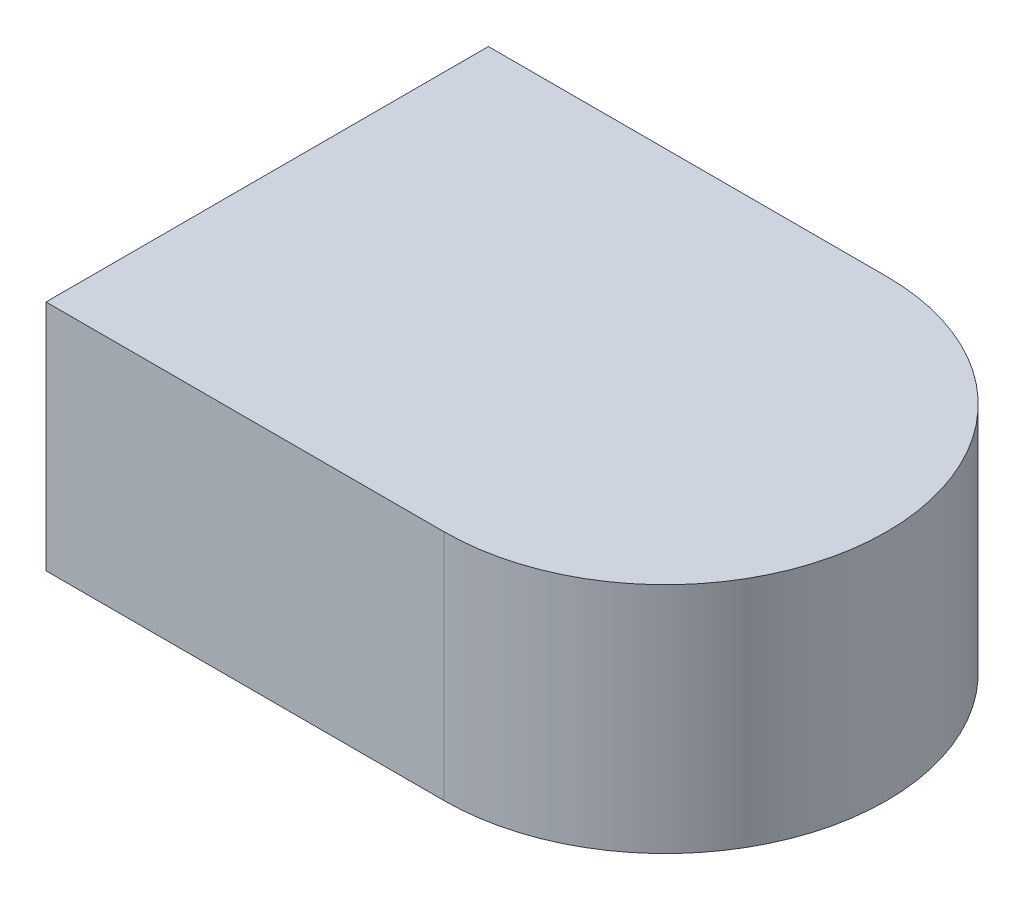
ISO-10303-21;
HEADER;
FILE_DESCRIPTION(('STEP AP214'),'2;1');
FILE_NAME('part.step','',(''),(''),'','','');
FILE_SCHEMA(('AUTOMOTIVE_DESIGN { 1 0 10303 214 1 1 1 1 }'));
ENDSEC;
DATA;
#1=APPLICATION_CONTEXT('core data for automotive mechanical design processes');
#2=APPLICATION_PROTOCOL_DEFINITION('international standard','automotive_design',2000,#1);
#3=PRODUCT_CONTEXT('',#1,'mechanical');
#4=PRODUCT('Part','Part','',(#3));
#5=PRODUCT_RELATED_PRODUCT_CATEGORY('part','',(#4));
#6=PRODUCT_DEFINITION_FORMATION('','',#4);
#7=PRODUCT_DEFINITION_CONTEXT('part definition',#1,'design');
#8=PRODUCT_DEFINITION('design','',#6,#7);
#9=PRODUCT_DEFINITION_SHAPE('','',#8);
#10=(LENGTH_UNIT() NAMED_UNIT(*) SI_UNIT(.MILLI.,.METRE.));
#11=(NAMED_UNIT(*) PLANE_ANGLE_UNIT() SI_UNIT($,.RADIAN.));
#12=(NAMED_UNIT(*) SI_UNIT($,.STERADIAN.) SOLID_ANGLE_UNIT());
#13=UNCERTAINTY_MEASURE_WITH_UNIT(LENGTH_MEASURE(1.E-05),#10,'distance_accuracy_value','');
#14=(GEOMETRIC_REPRESENTATION_CONTEXT(3) GLOBAL_UNCERTAINTY_ASSIGNED_CONTEXT((#13)) GLOBAL_UNIT_ASSIGNED_CONTEXT((#10,
#11,#12)) REPRESENTATION_CONTEXT('',''));
#15=CARTESIAN_POINT('',(0.,0.,0.));
#16=DIRECTION('',(0.,0.,1.));
#17=DIRECTION('',(1.,0.,0.));
#18=AXIS2_PLACEMENT_3D('',#15,#16,#17);
#19=CARTESIAN_POINT('',(0.,10.,0.));
#20=DIRECTION('',(1.,0.,0.));
#21=DIRECTION('',(0.,0.,-1.));
#22=AXIS2_PLACEMENT_3D('',#19,#20,#21);
#23=PLANE('',#22);
#24=DIRECTION('',(0.,0.,1.));
#25=VECTOR('',#24,1.);
#26=CARTESIAN_POINT('',(0.,0.,0.));
#27=LINE('',#26,#25);
#28=CARTESIAN_POINT('',(0.,0.,-19.));
#29=VERTEX_POINT('',#28);
#30=CARTESIAN_POINT('',(0.,0.,0.));
#31=VERTEX_POINT('',#30);
#32=EDGE_CURVE('E98',#29,#31,#27,.T.);
#33=ORIENTED_EDGE('',*,*,#32,.T.);
#34=DIRECTION('',(0.,-1.,0.));
#35=VECTOR('',#34,1.);
#36=CARTESIAN_POINT('',(0.,10.,0.));
#37=LINE('',#36,#35);
#38=CARTESIAN_POINT('',(0.,10.,0.));
#39=VERTEX_POINT('',#38);
#40=EDGE_CURVE('E11',#39,#31,#37,.T.);
#41=ORIENTED_EDGE('',*,*,#40,.F.);
#42=DIRECTION('',(0.,0.,1.));
#43=VECTOR('',#42,1.);
#44=CARTESIAN_POINT('',(0.,10.,0.));
#45=LINE('',#44,#43);
#46=CARTESIAN_POINT('',(0.,10.,-19.));
#47=VERTEX_POINT('',#46);
#48=EDGE_CURVE('E86',#47,#39,#45,.T.);
#49=ORIENTED_EDGE('',*,*,#48,.F.);
#50=DIRECTION('',(0.,-1.,0.));
#51=VECTOR('',#50,1.);
#52=CARTESIAN_POINT('',(0.,10.,-19.));
#53=LINE('',#52,#51);
#54=EDGE_CURVE('E94',#47,#29,#53,.T.);
#55=ORIENTED_EDGE('',*,*,#54,.T.);
#56=EDGE_LOOP('',(#33,#41,#49,#55));
#57=FACE_BOUND('',#56,.T.);
#58=ADVANCED_FACE('F35',(#57),#23,.F.);
#59=CARTESIAN_POINT('',(0.,10.,0.));
#60=DIRECTION('',(0.,0.,-1.));
#61=DIRECTION('',(-1.,0.,0.));
#62=AXIS2_PLACEMENT_3D('',#59,#60,#61);
#63=PLANE('',#62);
#64=DIRECTION('',(1.,0.,0.));
#65=VECTOR('',#64,1.);
#66=CARTESIAN_POINT('',(0.,0.,0.));
#67=LINE('',#66,#65);
#68=CARTESIAN_POINT('',(17.1,0.,0.));
#69=VERTEX_POINT('',#68);
#70=EDGE_CURVE('E90',#31,#69,#67,.T.);
#71=ORIENTED_EDGE('',*,*,#70,.T.);
#72=DIRECTION('',(0.,-1.,0.));
#73=VECTOR('',#72,1.);
#74=CARTESIAN_POINT('',(17.1,10.,0.));
#75=LINE('',#74,#73);
#76=CARTESIAN_POINT('',(17.1,10.,0.));
#77=VERTEX_POINT('',#76);
#78=EDGE_CURVE('E43',#77,#69,#75,.T.);
#79=ORIENTED_EDGE('',*,*,#78,.F.);
#80=DIRECTION('',(1.,0.,0.));
#81=VECTOR('',#80,1.);
#82=CARTESIAN_POINT('',(0.,10.,0.));
#83=LINE('',#82,#81);
#84=EDGE_CURVE('E81',#39,#77,#83,.T.);
#85=ORIENTED_EDGE('',*,*,#84,.F.);
#86=ORIENTED_EDGE('',*,*,#40,.T.);
#87=EDGE_LOOP('',(#71,#79,#85,#86));
#88=FACE_BOUND('',#87,.T.);
#89=ADVANCED_FACE('F89',(#88),#63,.F.);
#90=CARTESIAN_POINT('',(17.1,10.,-9.5));
#91=DIRECTION('',(0.,-1.,0.));
#92=DIRECTION('',(0.,0.,-1.));
#93=AXIS2_PLACEMENT_3D('',#90,#91,#92);
#94=CYLINDRICAL_SURFACE('',#93,9.5);
#95=CARTESIAN_POINT('',(17.1,0.,-9.5));
#96=DIRECTION('',(0.,1.,0.));
#97=DIRECTION('',(0.,0.,1.));
#98=AXIS2_PLACEMENT_3D('',#95,#96,#97);
#99=CIRCLE('',#98,9.5);
#100=CARTESIAN_POINT('',(17.1,0.,-19.));
#101=VERTEX_POINT('',#100);
#102=EDGE_CURVE('E68',#69,#101,#99,.T.);
#103=ORIENTED_EDGE('',*,*,#102,.T.);
#104=DIRECTION('',(0.,-1.,0.));
#105=VECTOR('',#104,1.);
#106=CARTESIAN_POINT('',(17.1,10.,-19.));
#107=LINE('',#106,#105);
#108=CARTESIAN_POINT('',(17.1,10.,-19.));
#109=VERTEX_POINT('',#108);
#110=EDGE_CURVE('E91',#109,#101,#107,.T.);
#111=ORIENTED_EDGE('',*,*,#110,.F.);
#112=CARTESIAN_POINT('',(17.1,10.,-9.5));
#113=DIRECTION('',(0.,1.,0.));
#114=DIRECTION('',(0.,0.,1.));
#115=AXIS2_PLACEMENT_3D('',#112,#113,#114);
#116=CIRCLE('',#115,9.5);
#117=EDGE_CURVE('E84',#77,#109,#116,.T.);
#118=ORIENTED_EDGE('',*,*,#117,.F.);
#119=ORIENTED_EDGE('',*,*,#78,.T.);
#120=EDGE_LOOP('',(#103,#111,#118,#119));
#121=FACE_BOUND('',#120,.T.);
#122=ADVANCED_FACE('F92',(#121),#94,.T.);
#123=CARTESIAN_POINT('',(0.,10.,-19.));
#124=DIRECTION('',(0.,0.,1.));
#125=DIRECTION('',(1.,0.,0.));
#126=AXIS2_PLACEMENT_3D('',#123,#124,#125);
#127=PLANE('',#126);
#128=DIRECTION('',(-1.,0.,0.));
#129=VECTOR('',#128,1.);
#130=CARTESIAN_POINT('',(0.,0.,-19.));
#131=LINE('',#130,#129);
#132=EDGE_CURVE('E74',#101,#29,#131,.T.);
#133=ORIENTED_EDGE('',*,*,#132,.T.);
#134=ORIENTED_EDGE('',*,*,#54,.F.);
#135=DIRECTION('',(-1.,0.,0.));
#136=VECTOR('',#135,1.);
#137=CARTESIAN_POINT('',(0.,10.,-19.));
#138=LINE('',#137,#136);
#139=EDGE_CURVE('E51',#109,#47,#138,.T.);
#140=ORIENTED_EDGE('',*,*,#139,.F.);
#141=ORIENTED_EDGE('',*,*,#110,.T.);
#142=EDGE_LOOP('',(#133,#134,#140,#141));
#143=FACE_BOUND('',#142,.T.);
#144=ADVANCED_FACE('F105',(#143),#127,.F.);
#145=CARTESIAN_POINT('',(17.1,10.,-9.5));
#146=DIRECTION('',(0.,1.,0.));
#147=DIRECTION('',(0.,0.,1.));
#148=AXIS2_PLACEMENT_3D('',#145,#146,#147);
#149=PLANE('',#148);
#150=ORIENTED_EDGE('',*,*,#48,.T.);
#151=ORIENTED_EDGE('',*,*,#84,.T.);
#152=ORIENTED_EDGE('',*,*,#117,.T.);
#153=ORIENTED_EDGE('',*,*,#139,.T.);
#154=EDGE_LOOP('',(#150,#151,#152,#153));
#155=FACE_BOUND('',#154,.T.);
#156=ADVANCED_FACE('F82',(#155),#149,.T.);
#157=CARTESIAN_POINT('',(17.1,0.,-9.5));
#158=DIRECTION('',(0.,1.,0.));
#159=DIRECTION('',(0.,0.,1.));
#160=AXIS2_PLACEMENT_3D('',#157,#158,#159);
#161=PLANE('',#160);
#162=ORIENTED_EDGE('',*,*,#32,.F.);
#163=ORIENTED_EDGE('',*,*,#132,.F.);
#164=ORIENTED_EDGE('',*,*,#102,.F.);
#165=ORIENTED_EDGE('',*,*,#70,.F.);
#166=EDGE_LOOP('',(#162,#163,#164,#165));
#167=FACE_BOUND('',#166,.T.);
#168=ADVANCED_FACE('F108',(#167),#161,.F.);
#169=CLOSED_SHELL('',(#58,#89,#122,#144,#156,#168));
#170=MANIFOLD_SOLID_BREP('B2',#169);
#171=ADVANCED_BREP_SHAPE_REPRESENTATION('',(#18,#170),#14);
#172=SHAPE_DEFINITION_REPRESENTATION(#9,#171);
ENDSEC;
END-ISO-10303-21;
